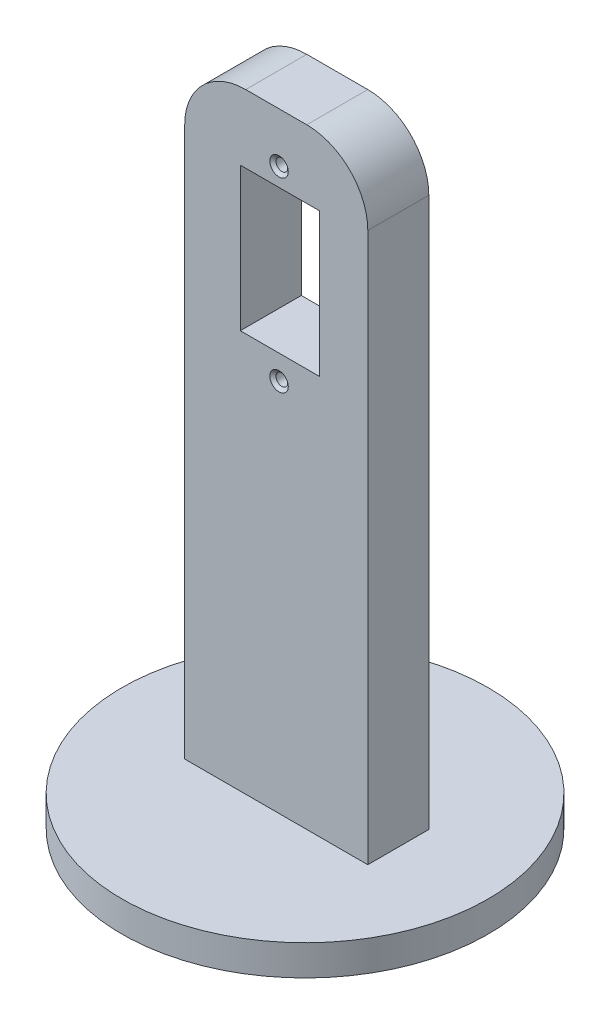
ISO-10303-21;
HEADER;
FILE_DESCRIPTION(('STEP AP214'),'2;1');
FILE_NAME('part.step','',(''),(''),'','','');
FILE_SCHEMA(('AUTOMOTIVE_DESIGN { 1 0 10303 214 1 1 1 1 }'));
ENDSEC;
DATA;
#1=APPLICATION_CONTEXT('core data for automotive mechanical design processes');
#2=APPLICATION_PROTOCOL_DEFINITION('international standard','automotive_design',2000,#1);
#3=PRODUCT_CONTEXT('',#1,'mechanical');
#4=PRODUCT('Part','Part','',(#3));
#5=PRODUCT_RELATED_PRODUCT_CATEGORY('part','',(#4));
#6=PRODUCT_DEFINITION_FORMATION('','',#4);
#7=PRODUCT_DEFINITION_CONTEXT('part definition',#1,'design');
#8=PRODUCT_DEFINITION('design','',#6,#7);
#9=PRODUCT_DEFINITION_SHAPE('','',#8);
#10=(LENGTH_UNIT() NAMED_UNIT(*) SI_UNIT(.MILLI.,.METRE.));
#11=(NAMED_UNIT(*) PLANE_ANGLE_UNIT() SI_UNIT($,.RADIAN.));
#12=(NAMED_UNIT(*) SI_UNIT($,.STERADIAN.) SOLID_ANGLE_UNIT());
#13=UNCERTAINTY_MEASURE_WITH_UNIT(LENGTH_MEASURE(1.E-05),#10,'distance_accuracy_value','');
#14=(GEOMETRIC_REPRESENTATION_CONTEXT(3) GLOBAL_UNCERTAINTY_ASSIGNED_CONTEXT((#13)) GLOBAL_UNIT_ASSIGNED_CONTEXT((#10,
#11,#12)) REPRESENTATION_CONTEXT('',''));
#15=CARTESIAN_POINT('',(0.,0.,0.));
#16=DIRECTION('',(0.,0.,1.));
#17=DIRECTION('',(1.,0.,0.));
#18=AXIS2_PLACEMENT_3D('',#15,#16,#17);
#19=CARTESIAN_POINT('',(49.6773080837469,70.3169604094147,10.));
#20=DIRECTION('',(0.,0.,-1.));
#21=DIRECTION('',(-1.,0.,0.));
#22=AXIS2_PLACEMENT_3D('',#19,#20,#21);
#23=CYLINDRICAL_SURFACE('',#22,9.99999999999999);
#24=CARTESIAN_POINT('',(49.6773080837469,70.3169604094147,0.));
#25=DIRECTION('',(0.,0.,1.));
#26=DIRECTION('',(-1.,0.,0.));
#27=AXIS2_PLACEMENT_3D('',#24,#25,#26);
#28=CIRCLE('',#27,9.99999999999999);
#29=CARTESIAN_POINT('',(59.6773080837469,70.3169604094146,0.));
#30=VERTEX_POINT('',#29);
#31=CARTESIAN_POINT('',(49.6773080837469,80.3169604094147,0.));
#32=VERTEX_POINT('',#31);
#33=EDGE_CURVE('E154',#30,#32,#28,.T.);
#34=ORIENTED_EDGE('',*,*,#33,.T.);
#35=DIRECTION('',(0.,0.,-1.));
#36=VECTOR('',#35,1.);
#37=CARTESIAN_POINT('',(49.6773080837469,80.3169604094147,10.));
#38=LINE('',#37,#36);
#39=CARTESIAN_POINT('',(49.6773080837469,80.3169604094147,10.));
#40=VERTEX_POINT('',#39);
#41=EDGE_CURVE('E11',#40,#32,#38,.T.);
#42=ORIENTED_EDGE('',*,*,#41,.F.);
#43=CARTESIAN_POINT('',(49.6773080837469,70.3169604094147,10.));
#44=DIRECTION('',(0.,0.,1.));
#45=DIRECTION('',(-1.,0.,0.));
#46=AXIS2_PLACEMENT_3D('',#43,#44,#45);
#47=CIRCLE('',#46,9.99999999999999);
#48=CARTESIAN_POINT('',(59.6773080837469,70.3169604094146,10.));
#49=VERTEX_POINT('',#48);
#50=EDGE_CURVE('E159',#49,#40,#47,.T.);
#51=ORIENTED_EDGE('',*,*,#50,.F.);
#52=DIRECTION('',(0.,0.,-1.));
#53=VECTOR('',#52,1.);
#54=CARTESIAN_POINT('',(59.6773080837469,70.3169604094146,10.));
#55=LINE('',#54,#53);
#56=EDGE_CURVE('E141',#49,#30,#55,.T.);
#57=ORIENTED_EDGE('',*,*,#56,.T.);
#58=EDGE_LOOP('',(#34,#42,#51,#57));
#59=FACE_BOUND('',#58,.T.);
#60=ADVANCED_FACE('F39',(#59),#23,.T.);
#61=CARTESIAN_POINT('',(39.6773080837469,80.3169604094147,10.));
#62=DIRECTION('',(0.,-1.,0.));
#63=DIRECTION('',(1.,0.,0.));
#64=AXIS2_PLACEMENT_3D('',#61,#62,#63);
#65=PLANE('',#64);
#66=DIRECTION('',(-1.,0.,0.));
#67=VECTOR('',#66,1.);
#68=CARTESIAN_POINT('',(39.6773080837469,80.3169604094147,0.));
#69=LINE('',#68,#67);
#70=CARTESIAN_POINT('',(39.6773080837469,80.3169604094147,0.));
#71=VERTEX_POINT('',#70);
#72=EDGE_CURVE('E153',#32,#71,#69,.T.);
#73=ORIENTED_EDGE('',*,*,#72,.T.);
#74=DIRECTION('',(0.,0.,-1.));
#75=VECTOR('',#74,1.);
#76=CARTESIAN_POINT('',(39.6773080837469,80.3169604094147,10.));
#77=LINE('',#76,#75);
#78=CARTESIAN_POINT('',(39.6773080837469,80.3169604094147,10.));
#79=VERTEX_POINT('',#78);
#80=EDGE_CURVE('E46',#79,#71,#77,.T.);
#81=ORIENTED_EDGE('',*,*,#80,.F.);
#82=DIRECTION('',(-1.,0.,0.));
#83=VECTOR('',#82,1.);
#84=CARTESIAN_POINT('',(39.6773080837469,80.3169604094147,10.));
#85=LINE('',#84,#83);
#86=EDGE_CURVE('E188',#40,#79,#85,.T.);
#87=ORIENTED_EDGE('',*,*,#86,.F.);
#88=ORIENTED_EDGE('',*,*,#41,.T.);
#89=EDGE_LOOP('',(#73,#81,#87,#88));
#90=FACE_BOUND('',#89,.T.);
#91=ADVANCED_FACE('F194',(#90),#65,.F.);
#92=CARTESIAN_POINT('',(39.6773080837469,70.3169604094147,10.));
#93=DIRECTION('',(0.,0.,-1.));
#94=DIRECTION('',(-1.,0.,0.));
#95=AXIS2_PLACEMENT_3D('',#92,#93,#94);
#96=CYLINDRICAL_SURFACE('',#95,10.);
#97=CARTESIAN_POINT('',(39.6773080837469,70.3169604094147,0.));
#98=DIRECTION('',(0.,0.,1.));
#99=DIRECTION('',(1.,0.,0.));
#100=AXIS2_PLACEMENT_3D('',#97,#98,#99);
#101=CIRCLE('',#100,10.);
#102=CARTESIAN_POINT('',(29.6773080837469,70.3169604094147,0.));
#103=VERTEX_POINT('',#102);
#104=EDGE_CURVE('E137',#71,#103,#101,.T.);
#105=ORIENTED_EDGE('',*,*,#104,.T.);
#106=DIRECTION('',(0.,0.,-1.));
#107=VECTOR('',#106,1.);
#108=CARTESIAN_POINT('',(29.6773080837469,70.3169604094147,10.));
#109=LINE('',#108,#107);
#110=CARTESIAN_POINT('',(29.6773080837469,70.3169604094147,10.));
#111=VERTEX_POINT('',#110);
#112=EDGE_CURVE('E134',#111,#103,#109,.T.);
#113=ORIENTED_EDGE('',*,*,#112,.F.);
#114=CARTESIAN_POINT('',(39.6773080837469,70.3169604094147,10.));
#115=DIRECTION('',(0.,0.,1.));
#116=DIRECTION('',(1.,0.,0.));
#117=AXIS2_PLACEMENT_3D('',#114,#115,#116);
#118=CIRCLE('',#117,10.);
#119=EDGE_CURVE('E151',#79,#111,#118,.T.);
#120=ORIENTED_EDGE('',*,*,#119,.F.);
#121=ORIENTED_EDGE('',*,*,#80,.T.);
#122=EDGE_LOOP('',(#105,#113,#120,#121));
#123=FACE_BOUND('',#122,.T.);
#124=ADVANCED_FACE('F148',(#123),#96,.T.);
#125=CARTESIAN_POINT('',(29.6773080837469,70.3169604094147,10.));
#126=DIRECTION('',(1.,0.,0.));
#127=DIRECTION('',(0.,1.,0.));
#128=AXIS2_PLACEMENT_3D('',#125,#126,#127);
#129=PLANE('',#128);
#130=DIRECTION('',(0.,-1.,0.));
#131=VECTOR('',#130,1.);
#132=CARTESIAN_POINT('',(29.6773080837469,70.3169604094147,0.));
#133=LINE('',#132,#131);
#134=CARTESIAN_POINT('',(29.6773080837469,-19.6830395905853,0.));
#135=VERTEX_POINT('',#134);
#136=EDGE_CURVE('E122',#103,#135,#133,.T.);
#137=ORIENTED_EDGE('',*,*,#136,.T.);
#138=DIRECTION('',(0.,0.,-1.));
#139=VECTOR('',#138,1.);
#140=CARTESIAN_POINT('',(29.6773080837469,-19.6830395905853,10.));
#141=LINE('',#140,#139);
#142=CARTESIAN_POINT('',(29.6773080837469,-19.6830395905853,10.));
#143=VERTEX_POINT('',#142);
#144=EDGE_CURVE('E135',#143,#135,#141,.T.);
#145=ORIENTED_EDGE('',*,*,#144,.F.);
#146=DIRECTION('',(0.,-1.,0.));
#147=VECTOR('',#146,1.);
#148=CARTESIAN_POINT('',(29.6773080837469,70.3169604094147,10.));
#149=LINE('',#148,#147);
#150=EDGE_CURVE('E167',#111,#143,#149,.T.);
#151=ORIENTED_EDGE('',*,*,#150,.F.);
#152=ORIENTED_EDGE('',*,*,#112,.T.);
#153=EDGE_LOOP('',(#137,#145,#151,#152));
#154=FACE_BOUND('',#153,.T.);
#155=ADVANCED_FACE('F128',(#154),#129,.F.);
#156=CARTESIAN_POINT('',(59.6773080837469,70.3169604094146,10.));
#157=DIRECTION('',(-1.,0.,0.));
#158=DIRECTION('',(0.,0.,1.));
#159=AXIS2_PLACEMENT_3D('',#156,#157,#158);
#160=PLANE('',#159);
#161=DIRECTION('',(0.,1.,0.));
#162=VECTOR('',#161,1.);
#163=CARTESIAN_POINT('',(59.6773080837469,70.3169604094146,0.));
#164=LINE('',#163,#162);
#165=CARTESIAN_POINT('',(59.6773080837469,-19.6830395905853,0.));
#166=VERTEX_POINT('',#165);
#167=EDGE_CURVE('E125',#166,#30,#164,.T.);
#168=ORIENTED_EDGE('',*,*,#167,.T.);
#169=ORIENTED_EDGE('',*,*,#56,.F.);
#170=DIRECTION('',(0.,1.,0.));
#171=VECTOR('',#170,1.);
#172=CARTESIAN_POINT('',(59.6773080837469,70.3169604094146,10.));
#173=LINE('',#172,#171);
#174=CARTESIAN_POINT('',(59.6773080837469,-19.6830395905853,10.));
#175=VERTEX_POINT('',#174);
#176=EDGE_CURVE('E163',#175,#49,#173,.T.);
#177=ORIENTED_EDGE('',*,*,#176,.F.);
#178=DIRECTION('',(0.,0.,-1.));
#179=VECTOR('',#178,1.);
#180=CARTESIAN_POINT('',(59.6773080837469,-19.6830395905853,10.));
#181=LINE('',#180,#179);
#182=EDGE_CURVE('E136',#175,#166,#181,.T.);
#183=ORIENTED_EDGE('',*,*,#182,.T.);
#184=EDGE_LOOP('',(#168,#169,#177,#183));
#185=FACE_BOUND('',#184,.T.);
#186=ADVANCED_FACE('F201',(#185),#160,.F.);
#187=CARTESIAN_POINT('',(49.6773080837469,70.3169604094147,10.));
#188=DIRECTION('',(0.,0.,-1.));
#189=DIRECTION('',(-1.,0.,0.));
#190=AXIS2_PLACEMENT_3D('',#187,#188,#189);
#191=PLANE('',#190);
#192=CARTESIAN_POINT('',(45.1364493540076,72.1488826551037,10.));
#193=DIRECTION('',(0.,0.,1.));
#194=DIRECTION('',(1.,0.,0.));
#195=AXIS2_PLACEMENT_3D('',#192,#193,#194);
#196=CIRCLE('',#195,1.5113);
#197=CARTESIAN_POINT('',(46.6477493540076,72.1488826551037,10.));
#198=VERTEX_POINT('',#197);
#199=EDGE_CURVE('E258',#198,#198,#196,.T.);
#200=ORIENTED_EDGE('',*,*,#199,.F.);
#201=EDGE_LOOP('',(#200));
#202=FACE_BOUND('',#201,.T.);
#203=CARTESIAN_POINT('',(45.1364493540076,41.6488826551037,10.));
#204=DIRECTION('',(0.,0.,1.));
#205=DIRECTION('',(1.,0.,0.));
#206=AXIS2_PLACEMENT_3D('',#203,#204,#205);
#207=CIRCLE('',#206,1.5113);
#208=CARTESIAN_POINT('',(46.6477493540076,41.6488826551037,10.));
#209=VERTEX_POINT('',#208);
#210=EDGE_CURVE('E274',#209,#209,#207,.T.);
#211=ORIENTED_EDGE('',*,*,#210,.F.);
#212=EDGE_LOOP('',(#211));
#213=FACE_BOUND('',#212,.T.);
#214=DIRECTION('',(1.,0.,0.));
#215=VECTOR('',#214,1.);
#216=CARTESIAN_POINT('',(38.7883449035869,45.6488826551037,10.));
#217=LINE('',#216,#215);
#218=CARTESIAN_POINT('',(38.7883449035869,45.6488826551037,10.));
#219=VERTEX_POINT('',#218);
#220=CARTESIAN_POINT('',(51.7883449035869,45.6488826551037,10.));
#221=VERTEX_POINT('',#220);
#222=EDGE_CURVE('E291',#219,#221,#217,.T.);
#223=ORIENTED_EDGE('',*,*,#222,.F.);
#224=DIRECTION('',(0.,-1.,0.));
#225=VECTOR('',#224,1.);
#226=CARTESIAN_POINT('',(38.7883449035869,69.1488826551037,10.));
#227=LINE('',#226,#225);
#228=CARTESIAN_POINT('',(38.7883449035869,69.1488826551037,10.));
#229=VERTEX_POINT('',#228);
#230=EDGE_CURVE('E52',#229,#219,#227,.T.);
#231=ORIENTED_EDGE('',*,*,#230,.F.);
#232=DIRECTION('',(-1.,0.,0.));
#233=VECTOR('',#232,1.);
#234=CARTESIAN_POINT('',(38.7883449035869,69.1488826551037,10.));
#235=LINE('',#234,#233);
#236=CARTESIAN_POINT('',(51.7883449035869,69.1488826551037,10.));
#237=VERTEX_POINT('',#236);
#238=EDGE_CURVE('E185',#237,#229,#235,.T.);
#239=ORIENTED_EDGE('',*,*,#238,.F.);
#240=DIRECTION('',(0.,1.,0.));
#241=VECTOR('',#240,1.);
#242=CARTESIAN_POINT('',(51.7883449035869,69.1488826551037,10.));
#243=LINE('',#242,#241);
#244=EDGE_CURVE('E294',#221,#237,#243,.T.);
#245=ORIENTED_EDGE('',*,*,#244,.F.);
#246=EDGE_LOOP('',(#223,#231,#239,#245));
#247=FACE_BOUND('',#246,.T.);
#248=ORIENTED_EDGE('',*,*,#50,.T.);
#249=ORIENTED_EDGE('',*,*,#86,.T.);
#250=ORIENTED_EDGE('',*,*,#119,.T.);
#251=ORIENTED_EDGE('',*,*,#150,.T.);
#252=DIRECTION('',(1.,0.,0.));
#253=VECTOR('',#252,1.);
#254=CARTESIAN_POINT('',(29.6773080837469,-19.6830395905853,10.));
#255=LINE('',#254,#253);
#256=EDGE_CURVE('E139',#143,#175,#255,.T.);
#257=ORIENTED_EDGE('',*,*,#256,.T.);
#258=ORIENTED_EDGE('',*,*,#176,.T.);
#259=EDGE_LOOP('',(#248,#249,#250,#251,#257,#258));
#260=FACE_BOUND('',#259,.T.);
#261=ADVANCED_FACE('F195',(#202,#213,#247,#260),#191,.F.);
#262=CARTESIAN_POINT('',(49.6773080837469,70.3169604094147,0.));
#263=DIRECTION('',(0.,0.,-1.));
#264=DIRECTION('',(-1.,0.,0.));
#265=AXIS2_PLACEMENT_3D('',#262,#263,#264);
#266=PLANE('',#265);
#267=CARTESIAN_POINT('',(45.1364493540076,72.1488826551037,0.));
#268=DIRECTION('',(0.,0.,1.));
#269=DIRECTION('',(1.,0.,0.));
#270=AXIS2_PLACEMENT_3D('',#267,#268,#269);
#271=CIRCLE('',#270,0.965199999999999);
#272=CARTESIAN_POINT('',(46.1016493540076,72.1488826551037,0.));
#273=VERTEX_POINT('',#272);
#274=EDGE_CURVE('E272',#273,#273,#271,.T.);
#275=ORIENTED_EDGE('',*,*,#274,.T.);
#276=EDGE_LOOP('',(#275));
#277=FACE_BOUND('',#276,.T.);
#278=CARTESIAN_POINT('',(45.1364493540076,41.6488826551037,0.));
#279=DIRECTION('',(0.,0.,1.));
#280=DIRECTION('',(1.,0.,0.));
#281=AXIS2_PLACEMENT_3D('',#278,#279,#280);
#282=CIRCLE('',#281,0.965199999999999);
#283=CARTESIAN_POINT('',(46.1016493540076,41.6488826551037,0.));
#284=VERTEX_POINT('',#283);
#285=EDGE_CURVE('E278',#284,#284,#282,.T.);
#286=ORIENTED_EDGE('',*,*,#285,.T.);
#287=EDGE_LOOP('',(#286));
#288=FACE_BOUND('',#287,.T.);
#289=DIRECTION('',(0.,-1.,0.));
#290=VECTOR('',#289,1.);
#291=CARTESIAN_POINT('',(38.7883449035869,69.1488826551037,0.));
#292=LINE('',#291,#290);
#293=CARTESIAN_POINT('',(38.7883449035869,69.1488826551037,0.));
#294=VERTEX_POINT('',#293);
#295=CARTESIAN_POINT('',(38.7883449035869,45.6488826551037,0.));
#296=VERTEX_POINT('',#295);
#297=EDGE_CURVE('E283',#294,#296,#292,.T.);
#298=ORIENTED_EDGE('',*,*,#297,.T.);
#299=DIRECTION('',(1.,0.,0.));
#300=VECTOR('',#299,1.);
#301=CARTESIAN_POINT('',(38.7883449035869,45.6488826551037,0.));
#302=LINE('',#301,#300);
#303=CARTESIAN_POINT('',(51.7883449035869,45.6488826551037,0.));
#304=VERTEX_POINT('',#303);
#305=EDGE_CURVE('E287',#296,#304,#302,.T.);
#306=ORIENTED_EDGE('',*,*,#305,.T.);
#307=DIRECTION('',(0.,1.,0.));
#308=VECTOR('',#307,1.);
#309=CARTESIAN_POINT('',(51.7883449035869,69.1488826551037,0.));
#310=LINE('',#309,#308);
#311=CARTESIAN_POINT('',(51.7883449035869,69.1488826551037,0.));
#312=VERTEX_POINT('',#311);
#313=EDGE_CURVE('E62',#304,#312,#310,.T.);
#314=ORIENTED_EDGE('',*,*,#313,.T.);
#315=DIRECTION('',(-1.,0.,0.));
#316=VECTOR('',#315,1.);
#317=CARTESIAN_POINT('',(38.7883449035869,69.1488826551037,0.));
#318=LINE('',#317,#316);
#319=EDGE_CURVE('E189',#312,#294,#318,.T.);
#320=ORIENTED_EDGE('',*,*,#319,.T.);
#321=EDGE_LOOP('',(#298,#306,#314,#320));
#322=FACE_BOUND('',#321,.T.);
#323=ORIENTED_EDGE('',*,*,#33,.F.);
#324=ORIENTED_EDGE('',*,*,#167,.F.);
#325=DIRECTION('',(1.,0.,0.));
#326=VECTOR('',#325,1.);
#327=CARTESIAN_POINT('',(29.6773080837469,-19.6830395905853,0.));
#328=LINE('',#327,#326);
#329=EDGE_CURVE('E116',#135,#166,#328,.T.);
#330=ORIENTED_EDGE('',*,*,#329,.F.);
#331=ORIENTED_EDGE('',*,*,#136,.F.);
#332=ORIENTED_EDGE('',*,*,#104,.F.);
#333=ORIENTED_EDGE('',*,*,#72,.F.);
#334=EDGE_LOOP('',(#323,#324,#330,#331,#332,#333));
#335=FACE_BOUND('',#334,.T.);
#336=ADVANCED_FACE('F118',(#277,#288,#322,#335),#266,.T.);
#337=CARTESIAN_POINT('',(38.7883449035869,69.1488826551037,0.));
#338=DIRECTION('',(-1.,0.,0.));
#339=DIRECTION('',(0.,0.,1.));
#340=AXIS2_PLACEMENT_3D('',#337,#338,#339);
#341=PLANE('',#340);
#342=ORIENTED_EDGE('',*,*,#230,.T.);
#343=DIRECTION('',(0.,0.,1.));
#344=VECTOR('',#343,1.);
#345=CARTESIAN_POINT('',(38.7883449035869,45.6488826551037,0.));
#346=LINE('',#345,#344);
#347=EDGE_CURVE('E187',#296,#219,#346,.T.);
#348=ORIENTED_EDGE('',*,*,#347,.F.);
#349=ORIENTED_EDGE('',*,*,#297,.F.);
#350=DIRECTION('',(0.,0.,1.));
#351=VECTOR('',#350,1.);
#352=CARTESIAN_POINT('',(38.7883449035869,69.1488826551037,0.));
#353=LINE('',#352,#351);
#354=EDGE_CURVE('E173',#294,#229,#353,.T.);
#355=ORIENTED_EDGE('',*,*,#354,.T.);
#356=EDGE_LOOP('',(#342,#348,#349,#355));
#357=FACE_BOUND('',#356,.T.);
#358=ADVANCED_FACE('F212',(#357),#341,.F.);
#359=CARTESIAN_POINT('',(38.7883449035869,69.1488826551037,0.));
#360=DIRECTION('',(0.,1.,0.));
#361=DIRECTION('',(-1.,0.,0.));
#362=AXIS2_PLACEMENT_3D('',#359,#360,#361);
#363=PLANE('',#362);
#364=ORIENTED_EDGE('',*,*,#238,.T.);
#365=ORIENTED_EDGE('',*,*,#354,.F.);
#366=ORIENTED_EDGE('',*,*,#319,.F.);
#367=DIRECTION('',(0.,0.,1.));
#368=VECTOR('',#367,1.);
#369=CARTESIAN_POINT('',(51.7883449035869,69.1488826551037,0.));
#370=LINE('',#369,#368);
#371=EDGE_CURVE('E174',#312,#237,#370,.T.);
#372=ORIENTED_EDGE('',*,*,#371,.T.);
#373=EDGE_LOOP('',(#364,#365,#366,#372));
#374=FACE_BOUND('',#373,.T.);
#375=ADVANCED_FACE('F218',(#374),#363,.F.);
#376=CARTESIAN_POINT('',(51.7883449035869,69.1488826551037,0.));
#377=DIRECTION('',(1.,0.,0.));
#378=DIRECTION('',(0.,0.,-1.));
#379=AXIS2_PLACEMENT_3D('',#376,#377,#378);
#380=PLANE('',#379);
#381=ORIENTED_EDGE('',*,*,#244,.T.);
#382=ORIENTED_EDGE('',*,*,#371,.F.);
#383=ORIENTED_EDGE('',*,*,#313,.F.);
#384=DIRECTION('',(0.,0.,1.));
#385=VECTOR('',#384,1.);
#386=CARTESIAN_POINT('',(51.7883449035869,45.6488826551037,0.));
#387=LINE('',#386,#385);
#388=EDGE_CURVE('E177',#304,#221,#387,.T.);
#389=ORIENTED_EDGE('',*,*,#388,.T.);
#390=EDGE_LOOP('',(#381,#382,#383,#389));
#391=FACE_BOUND('',#390,.T.);
#392=ADVANCED_FACE('F223',(#391),#380,.F.);
#393=CARTESIAN_POINT('',(38.7883449035869,45.6488826551037,0.));
#394=DIRECTION('',(0.,-1.,0.));
#395=DIRECTION('',(0.,0.,-1.));
#396=AXIS2_PLACEMENT_3D('',#393,#394,#395);
#397=PLANE('',#396);
#398=ORIENTED_EDGE('',*,*,#222,.T.);
#399=ORIENTED_EDGE('',*,*,#388,.F.);
#400=ORIENTED_EDGE('',*,*,#305,.F.);
#401=ORIENTED_EDGE('',*,*,#347,.T.);
#402=EDGE_LOOP('',(#398,#399,#400,#401));
#403=FACE_BOUND('',#402,.T.);
#404=ADVANCED_FACE('F217',(#403),#397,.F.);
#405=CARTESIAN_POINT('',(45.1364493540076,41.6488826551037,10.));
#406=DIRECTION('',(0.,0.,1.));
#407=DIRECTION('',(1.,0.,0.));
#408=AXIS2_PLACEMENT_3D('',#405,#406,#407);
#409=CYLINDRICAL_SURFACE('',#408,0.965199999999999);
#410=ORIENTED_EDGE('',*,*,#285,.F.);
#411=EDGE_LOOP('',(#410));
#412=FACE_BOUND('',#411,.T.);
#413=CARTESIAN_POINT('',(45.1364493540076,41.6488826551037,9.54176769141409));
#414=DIRECTION('',(0.,0.,1.));
#415=DIRECTION('',(1.,0.,0.));
#416=AXIS2_PLACEMENT_3D('',#413,#414,#415);
#417=CIRCLE('',#416,0.965199999999999);
#418=CARTESIAN_POINT('',(46.1016493540076,41.6488826551037,9.54176769141409));
#419=VERTEX_POINT('',#418);
#420=EDGE_CURVE('E280',#419,#419,#417,.T.);
#421=ORIENTED_EDGE('',*,*,#420,.T.);
#422=EDGE_LOOP('',(#421));
#423=FACE_BOUND('',#422,.T.);
#424=ADVANCED_FACE('F225',(#412,#423),#409,.F.);
#425=CARTESIAN_POINT('',(45.1364493540076,41.6488826551037,10.));
#426=DIRECTION('',(0.,0.,1.));
#427=DIRECTION('',(1.,0.,0.));
#428=AXIS2_PLACEMENT_3D('',#425,#426,#427);
#429=CONICAL_SURFACE('',#428,1.5113,0.872664625997163);
#430=ORIENTED_EDGE('',*,*,#420,.F.);
#431=EDGE_LOOP('',(#430));
#432=FACE_BOUND('',#431,.T.);
#433=ORIENTED_EDGE('',*,*,#210,.T.);
#434=EDGE_LOOP('',(#433));
#435=FACE_BOUND('',#434,.T.);
#436=ADVANCED_FACE('F235',(#432,#435),#429,.F.);
#437=CARTESIAN_POINT('',(45.1364493540076,72.1488826551037,10.));
#438=DIRECTION('',(0.,0.,1.));
#439=DIRECTION('',(1.,0.,0.));
#440=AXIS2_PLACEMENT_3D('',#437,#438,#439);
#441=CYLINDRICAL_SURFACE('',#440,0.965199999999999);
#442=ORIENTED_EDGE('',*,*,#274,.F.);
#443=EDGE_LOOP('',(#442));
#444=FACE_BOUND('',#443,.T.);
#445=CARTESIAN_POINT('',(45.1364493540076,72.1488826551037,9.54176769141409));
#446=DIRECTION('',(0.,0.,1.));
#447=DIRECTION('',(1.,0.,0.));
#448=AXIS2_PLACEMENT_3D('',#445,#446,#447);
#449=CIRCLE('',#448,0.965199999999999);
#450=CARTESIAN_POINT('',(46.1016493540076,72.1488826551037,9.54176769141409));
#451=VERTEX_POINT('',#450);
#452=EDGE_CURVE('E262',#451,#451,#449,.T.);
#453=ORIENTED_EDGE('',*,*,#452,.T.);
#454=EDGE_LOOP('',(#453));
#455=FACE_BOUND('',#454,.T.);
#456=ADVANCED_FACE('F236',(#444,#455),#441,.F.);
#457=CARTESIAN_POINT('',(45.1364493540076,72.1488826551037,10.));
#458=DIRECTION('',(0.,0.,1.));
#459=DIRECTION('',(1.,0.,0.));
#460=AXIS2_PLACEMENT_3D('',#457,#458,#459);
#461=CONICAL_SURFACE('',#460,1.5113,0.872664625997163);
#462=ORIENTED_EDGE('',*,*,#452,.F.);
#463=EDGE_LOOP('',(#462));
#464=FACE_BOUND('',#463,.T.);
#465=ORIENTED_EDGE('',*,*,#199,.T.);
#466=EDGE_LOOP('',(#465));
#467=FACE_BOUND('',#466,.T.);
#468=ADVANCED_FACE('F239',(#464,#467),#461,.F.);
#469=CARTESIAN_POINT('',(44.3981656645143,-19.6830395905853,5.));
#470=DIRECTION('',(0.,-1.,0.));
#471=DIRECTION('',(0.,0.,-1.));
#472=AXIS2_PLACEMENT_3D('',#469,#470,#471);
#473=PLANE('',#472);
#474=CARTESIAN_POINT('',(44.3981656645143,-19.6830395905853,5.));
#475=DIRECTION('',(0.,-1.,0.));
#476=DIRECTION('',(0.,0.,-1.));
#477=AXIS2_PLACEMENT_3D('',#474,#475,#476);
#478=CIRCLE('',#477,30.);
#479=CARTESIAN_POINT('',(44.3981656645143,-19.6830395905853,-25.));
#480=VERTEX_POINT('',#479);
#481=EDGE_CURVE('E261',#480,#480,#478,.T.);
#482=ORIENTED_EDGE('',*,*,#481,.F.);
#483=EDGE_LOOP('',(#482));
#484=FACE_BOUND('',#483,.T.);
#485=ORIENTED_EDGE('',*,*,#144,.T.);
#486=ORIENTED_EDGE('',*,*,#329,.T.);
#487=ORIENTED_EDGE('',*,*,#182,.F.);
#488=ORIENTED_EDGE('',*,*,#256,.F.);
#489=EDGE_LOOP('',(#485,#486,#487,#488));
#490=FACE_BOUND('',#489,.T.);
#491=ADVANCED_FACE('F138',(#484,#490),#473,.F.);
#492=CARTESIAN_POINT('',(44.3981656645143,-24.6830395905853,5.));
#493=DIRECTION('',(0.,1.,0.));
#494=DIRECTION('',(0.,0.,1.));
#495=AXIS2_PLACEMENT_3D('',#492,#493,#494);
#496=CYLINDRICAL_SURFACE('',#495,30.);
#497=CARTESIAN_POINT('',(44.3981656645143,-24.6830395905853,5.));
#498=DIRECTION('',(0.,-1.,0.));
#499=DIRECTION('',(0.,0.,-1.));
#500=AXIS2_PLACEMENT_3D('',#497,#498,#499);
#501=CIRCLE('',#500,30.);
#502=CARTESIAN_POINT('',(44.3981656645143,-24.6830395905853,-25.));
#503=VERTEX_POINT('',#502);
#504=EDGE_CURVE('E256',#503,#503,#501,.T.);
#505=ORIENTED_EDGE('',*,*,#504,.F.);
#506=EDGE_LOOP('',(#505));
#507=FACE_BOUND('',#506,.T.);
#508=ORIENTED_EDGE('',*,*,#481,.T.);
#509=EDGE_LOOP('',(#508));
#510=FACE_BOUND('',#509,.T.);
#511=ADVANCED_FACE('F244',(#507,#510),#496,.T.);
#512=CARTESIAN_POINT('',(44.3981656645143,-24.6830395905853,5.));
#513=DIRECTION('',(0.,-1.,0.));
#514=DIRECTION('',(0.,0.,-1.));
#515=AXIS2_PLACEMENT_3D('',#512,#513,#514);
#516=PLANE('',#515);
#517=ORIENTED_EDGE('',*,*,#504,.T.);
#518=EDGE_LOOP('',(#517));
#519=FACE_BOUND('',#518,.T.);
#520=ADVANCED_FACE('F247',(#519),#516,.T.);
#521=CLOSED_SHELL('',(#60,#91,#124,#155,#186,#261,#336,#358,#375,#392,#404,#424,#436,#456,#468,
#491,#511,#520));
#522=MANIFOLD_SOLID_BREP('B2',#521);
#523=ADVANCED_BREP_SHAPE_REPRESENTATION('',(#18,#522),#14);
#524=SHAPE_DEFINITION_REPRESENTATION(#9,#523);
ENDSEC;
END-ISO-10303-21;
